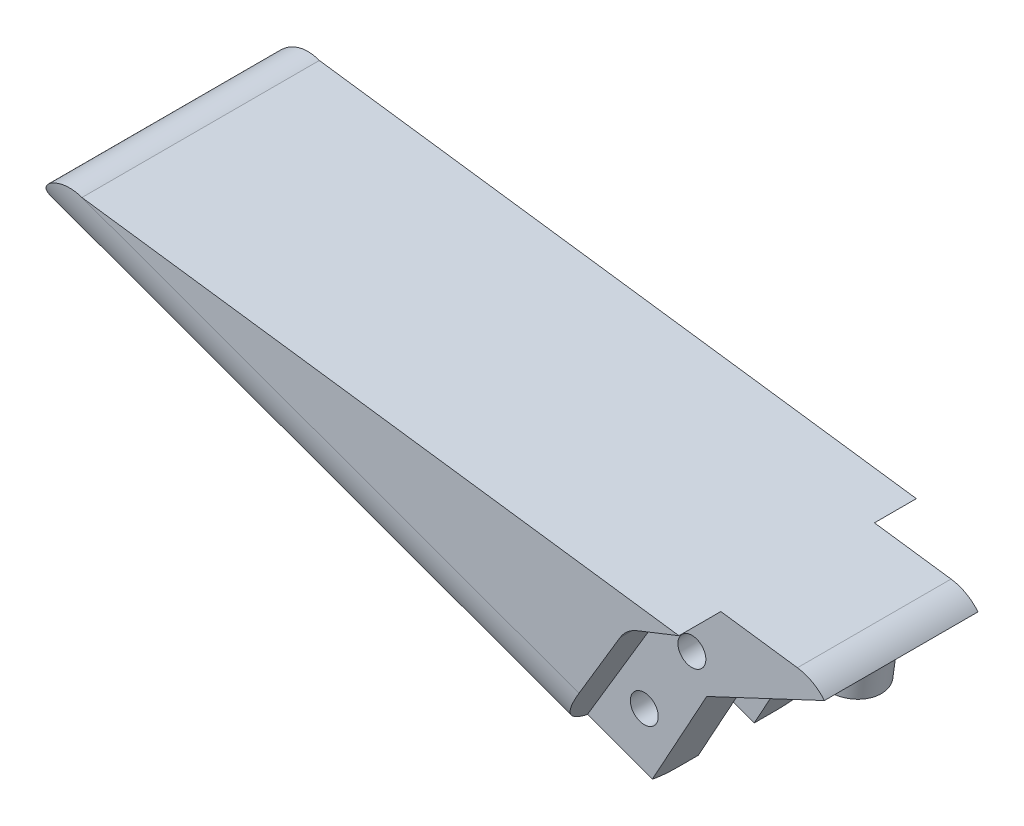
ISO-10303-21;
HEADER;
FILE_DESCRIPTION(('STEP AP214'),'2;1');
FILE_NAME('part.step','',(''),(''),'','','');
FILE_SCHEMA(('AUTOMOTIVE_DESIGN { 1 0 10303 214 1 1 1 1 }'));
ENDSEC;
DATA;
#1=APPLICATION_CONTEXT('core data for automotive mechanical design processes');
#2=APPLICATION_PROTOCOL_DEFINITION('international standard','automotive_design',2000,#1);
#3=PRODUCT_CONTEXT('',#1,'mechanical');
#4=PRODUCT('Part','Part','',(#3));
#5=PRODUCT_RELATED_PRODUCT_CATEGORY('part','',(#4));
#6=PRODUCT_DEFINITION_FORMATION('','',#4);
#7=PRODUCT_DEFINITION_CONTEXT('part definition',#1,'design');
#8=PRODUCT_DEFINITION('design','',#6,#7);
#9=PRODUCT_DEFINITION_SHAPE('','',#8);
#10=(LENGTH_UNIT() NAMED_UNIT(*) SI_UNIT(.MILLI.,.METRE.));
#11=(NAMED_UNIT(*) PLANE_ANGLE_UNIT() SI_UNIT($,.RADIAN.));
#12=(NAMED_UNIT(*) SI_UNIT($,.STERADIAN.) SOLID_ANGLE_UNIT());
#13=UNCERTAINTY_MEASURE_WITH_UNIT(LENGTH_MEASURE(1.E-05),#10,'distance_accuracy_value','');
#14=(GEOMETRIC_REPRESENTATION_CONTEXT(3) GLOBAL_UNCERTAINTY_ASSIGNED_CONTEXT((#13)) GLOBAL_UNIT_ASSIGNED_CONTEXT((#10,
#11,#12)) REPRESENTATION_CONTEXT('',''));
#15=CARTESIAN_POINT('',(0.,0.,0.));
#16=DIRECTION('',(0.,0.,1.));
#17=DIRECTION('',(1.,0.,0.));
#18=AXIS2_PLACEMENT_3D('',#15,#16,#17);
#19=CARTESIAN_POINT('',(-13.6045972487513,55.7098074103546,17.));
#20=DIRECTION('',(0.,0.,-1.));
#21=DIRECTION('',(-1.,0.,0.));
#22=AXIS2_PLACEMENT_3D('',#19,#20,#21);
#23=CYLINDRICAL_SURFACE('',#22,2.99999999999999);
#24=CARTESIAN_POINT('',(-13.6045972487513,55.7098074103546,14.));
#25=DIRECTION('',(0.,0.,1.));
#26=DIRECTION('',(1.,0.,0.));
#27=AXIS2_PLACEMENT_3D('',#24,#25,#26);
#28=CIRCLE('',#27,2.99999999999999);
#29=CARTESIAN_POINT('',(-11.2868379370372,57.6145362028503,14.));
#30=VERTEX_POINT('',#29);
#31=CARTESIAN_POINT('',(-13.21776763611,58.6847633513364,14.));
#32=VERTEX_POINT('',#31);
#33=EDGE_CURVE('E293',#30,#32,#28,.T.);
#34=ORIENTED_EDGE('',*,*,#33,.F.);
#35=DIRECTION('',(0.,0.,-1.));
#36=VECTOR('',#35,1.);
#37=CARTESIAN_POINT('',(-11.2868379370372,57.6145362028503,17.));
#38=LINE('',#37,#36);
#39=CARTESIAN_POINT('',(-11.2868379370372,57.6145362028503,3.));
#40=VERTEX_POINT('',#39);
#41=EDGE_CURVE('E215',#30,#40,#38,.T.);
#42=ORIENTED_EDGE('',*,*,#41,.T.);
#43=CARTESIAN_POINT('',(-13.6045972487513,55.7098074103546,3.));
#44=DIRECTION('',(0.,0.,-1.));
#45=DIRECTION('',(-1.,0.,0.));
#46=AXIS2_PLACEMENT_3D('',#43,#44,#45);
#47=CIRCLE('',#46,2.99999999999999);
#48=CARTESIAN_POINT('',(-13.21776763611,58.6847633513364,3.));
#49=VERTEX_POINT('',#48);
#50=EDGE_CURVE('E256',#49,#40,#47,.T.);
#51=ORIENTED_EDGE('',*,*,#50,.F.);
#52=DIRECTION('',(0.,0.,-1.));
#53=VECTOR('',#52,1.);
#54=CARTESIAN_POINT('',(-13.21776763611,58.6847633513364,17.));
#55=LINE('',#54,#53);
#56=EDGE_CURVE('E335',#32,#49,#55,.T.);
#57=ORIENTED_EDGE('',*,*,#56,.F.);
#58=EDGE_LOOP('',(#34,#42,#51,#57));
#59=FACE_BOUND('',#58,.T.);
#60=ADVANCED_FACE('F34',(#59),#23,.T.);
#61=CARTESIAN_POINT('',(-20.7770366055683,55.9187207990802,17.));
#62=DIRECTION('',(0.,0.,-1.));
#63=DIRECTION('',(-1.,0.,0.));
#64=AXIS2_PLACEMENT_3D('',#61,#62,#63);
#65=CYLINDRICAL_SURFACE('',#64,1.00000000000006);
#66=CARTESIAN_POINT('',(-20.7770366055683,55.9187207990802,14.));
#67=DIRECTION('',(0.,0.,1.));
#68=DIRECTION('',(1.,0.,0.));
#69=AXIS2_PLACEMENT_3D('',#66,#67,#68);
#70=CIRCLE('',#69,1.00000000000006);
#71=CARTESIAN_POINT('',(-19.7770366055683,55.9187207990802,14.));
#72=VERTEX_POINT('',#71);
#73=EDGE_CURVE('E287',#72,#72,#70,.T.);
#74=ORIENTED_EDGE('',*,*,#73,.T.);
#75=EDGE_LOOP('',(#74));
#76=FACE_BOUND('',#75,.T.);
#77=CARTESIAN_POINT('',(-20.7770366055683,55.9187207990802,3.));
#78=DIRECTION('',(0.,0.,-1.));
#79=DIRECTION('',(-1.,0.,0.));
#80=AXIS2_PLACEMENT_3D('',#77,#78,#79);
#81=CIRCLE('',#80,1.00000000000006);
#82=CARTESIAN_POINT('',(-21.7770366055684,55.9187207990802,3.));
#83=VERTEX_POINT('',#82);
#84=EDGE_CURVE('E262',#83,#83,#81,.T.);
#85=ORIENTED_EDGE('',*,*,#84,.T.);
#86=EDGE_LOOP('',(#85));
#87=FACE_BOUND('',#86,.T.);
#88=ADVANCED_FACE('F382',(#76,#87),#65,.F.);
#89=CARTESIAN_POINT('',(12.0644372106127,33.1538775251646,17.));
#90=DIRECTION('',(-0.341955384918189,-0.939716188391715,0.));
#91=DIRECTION('',(0.939716188391715,-0.341955384918189,0.));
#92=AXIS2_PLACEMENT_3D('',#89,#90,#91);
#93=PLANE('',#92);
#94=DIRECTION('',(0.,0.,-1.));
#95=VECTOR('',#94,1.);
#96=CARTESIAN_POINT('',(-23.8120937126513,46.2090670525373,17.));
#97=LINE('',#96,#95);
#98=CARTESIAN_POINT('',(-23.8120937126513,46.2090670525373,12.));
#99=VERTEX_POINT('',#98);
#100=CARTESIAN_POINT('',(-23.8120937126513,46.2090670525373,10.5));
#101=VERTEX_POINT('',#100);
#102=EDGE_CURVE('E229',#99,#101,#97,.T.);
#103=ORIENTED_EDGE('',*,*,#102,.F.);
#104=DIRECTION('',(-0.939716188391715,0.341955384918189,0.));
#105=VECTOR('',#104,1.);
#106=CARTESIAN_POINT('',(12.0644372106127,33.1538775251646,12.));
#107=LINE('',#106,#105);
#108=CARTESIAN_POINT('',(-63.1643616155397,60.5290501329251,12.));
#109=VERTEX_POINT('',#108);
#110=EDGE_CURVE('E358',#99,#109,#107,.T.);
#111=ORIENTED_EDGE('',*,*,#110,.T.);
#112=DIRECTION('',(0.,0.,-1.));
#113=VECTOR('',#112,1.);
#114=CARTESIAN_POINT('',(-63.1643616155397,60.5290501329251,17.));
#115=LINE('',#114,#113);
#116=CARTESIAN_POINT('',(-63.1643616155397,60.5290501329251,5.));
#117=VERTEX_POINT('',#116);
#118=EDGE_CURVE('E327',#109,#117,#115,.T.);
#119=ORIENTED_EDGE('',*,*,#118,.T.);
#120=DIRECTION('',(-0.939716188391715,0.341955384918189,0.));
#121=VECTOR('',#120,1.);
#122=CARTESIAN_POINT('',(-28.4721657385242,47.9048308831904,5.));
#123=LINE('',#122,#121);
#124=CARTESIAN_POINT('',(-23.8120937126513,46.2090670525373,5.));
#125=VERTEX_POINT('',#124);
#126=EDGE_CURVE('E190',#117,#125,#123,.F.);
#127=ORIENTED_EDGE('',*,*,#126,.T.);
#128=CARTESIAN_POINT('',(-23.8120937126513,46.2090670525373,6.5));
#129=VERTEX_POINT('',#128);
#130=EDGE_CURVE('E226',#129,#125,#97,.T.);
#131=ORIENTED_EDGE('',*,*,#130,.F.);
#132=DIRECTION('',(-0.939716188391715,0.341955384918189,0.));
#133=VECTOR('',#132,1.);
#134=CARTESIAN_POINT('',(12.0644372106127,33.1538775251646,6.5));
#135=LINE('',#134,#133);
#136=CARTESIAN_POINT('',(-26.6857847576768,47.2547807899152,6.5));
#137=VERTEX_POINT('',#136);
#138=EDGE_CURVE('E321',#129,#137,#135,.T.);
#139=ORIENTED_EDGE('',*,*,#138,.T.);
#140=DIRECTION('',(0.,0.,-1.));
#141=VECTOR('',#140,1.);
#142=CARTESIAN_POINT('',(-26.6857847576768,47.2547807899152,17.));
#143=LINE('',#142,#141);
#144=CARTESIAN_POINT('',(-26.6857847576768,47.2547807899152,10.5));
#145=VERTEX_POINT('',#144);
#146=EDGE_CURVE('E338',#145,#137,#143,.T.);
#147=ORIENTED_EDGE('',*,*,#146,.F.);
#148=DIRECTION('',(-0.939716188391715,0.341955384918189,0.));
#149=VECTOR('',#148,1.);
#150=CARTESIAN_POINT('',(12.0644372106127,33.1538775251646,10.5));
#151=LINE('',#150,#149);
#152=EDGE_CURVE('E318',#101,#145,#151,.T.);
#153=ORIENTED_EDGE('',*,*,#152,.F.);
#154=EDGE_LOOP('',(#103,#111,#119,#127,#131,#139,#147,#153));
#155=FACE_BOUND('',#154,.T.);
#156=ADVANCED_FACE('F394',(#155),#93,.T.);
#157=CARTESIAN_POINT('',(-24.1857847576768,50.6704531495727,17.));
#158=DIRECTION('',(0.,0.,-1.));
#159=DIRECTION('',(-1.,0.,0.));
#160=AXIS2_PLACEMENT_3D('',#157,#158,#159);
#161=CYLINDRICAL_SURFACE('',#160,1.00000000000012);
#162=CARTESIAN_POINT('',(-24.1857847576768,50.6704531495727,6.5));
#163=DIRECTION('',(0.,0.,1.));
#164=DIRECTION('',(1.,0.,0.));
#165=AXIS2_PLACEMENT_3D('',#162,#163,#164);
#166=CIRCLE('',#165,1.00000000000012);
#167=CARTESIAN_POINT('',(-23.1857847576767,50.6704531495727,6.5));
#168=VERTEX_POINT('',#167);
#169=EDGE_CURVE('E320',#168,#168,#166,.T.);
#170=ORIENTED_EDGE('',*,*,#169,.T.);
#171=EDGE_LOOP('',(#170));
#172=FACE_BOUND('',#171,.T.);
#173=CARTESIAN_POINT('',(-24.1857847576768,50.6704531495727,3.));
#174=DIRECTION('',(0.,0.,-1.));
#175=DIRECTION('',(-1.,0.,0.));
#176=AXIS2_PLACEMENT_3D('',#173,#174,#175);
#177=CIRCLE('',#176,1.00000000000012);
#178=CARTESIAN_POINT('',(-25.1857847576769,50.6704531495727,3.));
#179=VERTEX_POINT('',#178);
#180=EDGE_CURVE('E259',#179,#179,#177,.T.);
#181=ORIENTED_EDGE('',*,*,#180,.T.);
#182=EDGE_LOOP('',(#181));
#183=FACE_BOUND('',#182,.T.);
#184=ADVANCED_FACE('F389',(#172,#183),#161,.F.);
#185=CARTESIAN_POINT('',(7.57743523478366,55.8640908862791,17.));
#186=DIRECTION('',(0.134409712739819,0.990925844410771,0.));
#187=DIRECTION('',(-0.990925844410771,0.134409712739819,0.));
#188=AXIS2_PLACEMENT_3D('',#185,#186,#187);
#189=PLANE('',#188);
#190=DIRECTION('',(-0.990925844410771,0.134409712739819,0.));
#191=VECTOR('',#190,1.);
#192=CARTESIAN_POINT('',(7.57743523478366,55.8640908862791,3.));
#193=LINE('',#192,#191);
#194=CARTESIAN_POINT('',(-18.702448286186,59.4287083748762,3.));
#195=VERTEX_POINT('',#194);
#196=EDGE_CURVE('E351',#49,#195,#193,.T.);
#197=ORIENTED_EDGE('',*,*,#196,.T.);
#198=DIRECTION('',(0.,0.,-1.));
#199=VECTOR('',#198,1.);
#200=CARTESIAN_POINT('',(-18.702448286186,59.4287083748762,17.));
#201=LINE('',#200,#199);
#202=CARTESIAN_POINT('',(-18.702448286186,59.4287083748762,0.));
#203=VERTEX_POINT('',#202);
#204=EDGE_CURVE('E251',#195,#203,#201,.T.);
#205=ORIENTED_EDGE('',*,*,#204,.T.);
#206=DIRECTION('',(0.990925844410771,-0.134409712739819,0.));
#207=VECTOR('',#206,1.);
#208=CARTESIAN_POINT('',(7.57743523478366,55.8640908862791,0.));
#209=LINE('',#208,#207);
#210=CARTESIAN_POINT('',(-61.4545846909488,65.2276310748837,0.));
#211=VERTEX_POINT('',#210);
#212=EDGE_CURVE('E323',#211,#203,#209,.T.);
#213=ORIENTED_EDGE('',*,*,#212,.F.);
#214=DIRECTION('',(0.,0.,-1.));
#215=VECTOR('',#214,1.);
#216=CARTESIAN_POINT('',(-61.4545846909488,65.2276310748837,17.));
#217=LINE('',#216,#215);
#218=CARTESIAN_POINT('',(-61.4545846909488,65.2276310748837,17.));
#219=VERTEX_POINT('',#218);
#220=EDGE_CURVE('E332',#219,#211,#217,.T.);
#221=ORIENTED_EDGE('',*,*,#220,.F.);
#222=DIRECTION('',(0.990925844410771,-0.134409712739819,0.));
#223=VECTOR('',#222,1.);
#224=CARTESIAN_POINT('',(7.57743523478366,55.8640908862791,17.));
#225=LINE('',#224,#223);
#226=CARTESIAN_POINT('',(-18.702448286186,59.4287083748762,17.));
#227=VERTEX_POINT('',#226);
#228=EDGE_CURVE('E324',#219,#227,#225,.T.);
#229=ORIENTED_EDGE('',*,*,#228,.T.);
#230=DIRECTION('',(0.,0.,1.));
#231=VECTOR('',#230,1.);
#232=CARTESIAN_POINT('',(-18.702448286186,59.4287083748762,17.));
#233=LINE('',#232,#231);
#234=CARTESIAN_POINT('',(-18.702448286186,59.4287083748762,14.));
#235=VERTEX_POINT('',#234);
#236=EDGE_CURVE('E282',#235,#227,#233,.T.);
#237=ORIENTED_EDGE('',*,*,#236,.F.);
#238=DIRECTION('',(0.990925844410771,-0.134409712739819,0.));
#239=VECTOR('',#238,1.);
#240=CARTESIAN_POINT('',(7.57743523478366,55.8640908862791,14.));
#241=LINE('',#240,#239);
#242=EDGE_CURVE('E290',#235,#32,#241,.T.);
#243=ORIENTED_EDGE('',*,*,#242,.T.);
#244=ORIENTED_EDGE('',*,*,#56,.T.);
#245=EDGE_LOOP('',(#197,#205,#213,#221,#229,#237,#243,#244));
#246=FACE_BOUND('',#245,.T.);
#247=ADVANCED_FACE('F384',(#246),#189,.T.);
#248=CARTESIAN_POINT('',(0.,0.,0.));
#249=DIRECTION('',(0.,0.,1.));
#250=DIRECTION('',(1.,0.,0.));
#251=AXIS2_PLACEMENT_3D('',#248,#249,#250);
#252=PLANE('',#251);
#253=DIRECTION('',(-0.512546839070499,-0.858659267555437,0.));
#254=VECTOR('',#253,1.);
#255=CARTESIAN_POINT('',(-22.9236847744569,57.2000878967567,0.));
#256=LINE('',#255,#254);
#257=CARTESIAN_POINT('',(-22.9236847744569,57.2000878967567,0.));
#258=VERTEX_POINT('',#257);
#259=CARTESIAN_POINT('',(-25.862892986667,52.276092315658,0.));
#260=VERTEX_POINT('',#259);
#261=EDGE_CURVE('E238',#258,#260,#256,.T.);
#262=ORIENTED_EDGE('',*,*,#261,.T.);
#263=DIRECTION('',(-0.939716188391715,0.341955384918189,0.));
#264=VECTOR('',#263,1.);
#265=CARTESIAN_POINT('',(-61.4545846909488,65.2276310748837,0.));
#266=LINE('',#265,#264);
#267=EDGE_CURVE('E424',#260,#211,#266,.T.);
#268=ORIENTED_EDGE('',*,*,#267,.T.);
#269=ORIENTED_EDGE('',*,*,#212,.T.);
#270=DIRECTION('',(0.929799683237032,0.368065957475443,0.));
#271=VECTOR('',#270,1.);
#272=CARTESIAN_POINT('',(-22.8718132152463,57.7782439551245,0.));
#273=LINE('',#272,#271);
#274=CARTESIAN_POINT('',(-21.697201499257,58.243220007173,0.));
#275=VERTEX_POINT('',#274);
#276=EDGE_CURVE('E347',#275,#203,#273,.T.);
#277=ORIENTED_EDGE('',*,*,#276,.F.);
#278=CARTESIAN_POINT('',(-20.7770366055684,55.9187207990804,0.));
#279=DIRECTION('',(0.,0.,1.));
#280=DIRECTION('',(1.,0.,0.));
#281=AXIS2_PLACEMENT_3D('',#278,#279,#280);
#282=CIRCLE('',#281,2.5);
#283=EDGE_CURVE('E243',#275,#258,#282,.T.);
#284=ORIENTED_EDGE('',*,*,#283,.T.);
#285=EDGE_LOOP('',(#262,#268,#269,#277,#284));
#286=FACE_BOUND('',#285,.T.);
#287=ADVANCED_FACE('F388',(#286),#252,.F.);
#288=CARTESIAN_POINT('',(-24.1857847576768,50.6704531495727,10.5));
#289=DIRECTION('',(0.,0.,1.));
#290=DIRECTION('',(1.,0.,0.));
#291=AXIS2_PLACEMENT_3D('',#288,#289,#290);
#292=CIRCLE('',#291,1.00000000000012);
#293=CARTESIAN_POINT('',(-23.1857847576767,50.6704531495727,10.5));
#294=VERTEX_POINT('',#293);
#295=EDGE_CURVE('E315',#294,#294,#292,.T.);
#296=ORIENTED_EDGE('',*,*,#295,.F.);
#297=EDGE_LOOP('',(#296));
#298=FACE_BOUND('',#297,.T.);
#299=CARTESIAN_POINT('',(-24.1857847576768,50.6704531495727,14.));
#300=DIRECTION('',(0.,0.,1.));
#301=DIRECTION('',(1.,0.,0.));
#302=AXIS2_PLACEMENT_3D('',#299,#300,#301);
#303=CIRCLE('',#302,1.00000000000012);
#304=CARTESIAN_POINT('',(-23.1857847576767,50.6704531495727,14.));
#305=VERTEX_POINT('',#304);
#306=EDGE_CURVE('E286',#305,#305,#303,.T.);
#307=ORIENTED_EDGE('',*,*,#306,.T.);
#308=EDGE_LOOP('',(#307));
#309=FACE_BOUND('',#308,.T.);
#310=ADVANCED_FACE('F380',(#298,#309),#161,.F.);
#311=CARTESIAN_POINT('',(-62.3094731532442,62.8783406039045,17.));
#312=DIRECTION('',(0.,0.,-1.));
#313=DIRECTION('',(-1.,0.,0.));
#314=AXIS2_PLACEMENT_3D('',#311,#312,#313);
#315=CYLINDRICAL_SURFACE('',#314,2.49999999999995);
#316=ORIENTED_EDGE('',*,*,#118,.F.);
#317=CARTESIAN_POINT('',(-61.4545846909488,65.2276310748837,17.));
#318=CARTESIAN_POINT('',(-61.5204900513567,65.2516205941729,16.9999890662718));
#319=CARTESIAN_POINT('',(-61.5874061855276,65.2728230518161,16.9999997162415));
#320=CARTESIAN_POINT('',(-61.7227799949917,65.3095339566756,16.999984625409));
#321=CARTESIAN_POINT('',(-61.7912376128699,65.3250426155947,16.9999588859599));
#322=CARTESIAN_POINT('',(-61.929210997852,65.3502463109526,16.9997914792829));
#323=CARTESIAN_POINT('',(-61.9987266357616,65.3599420514555,16.9996498260994));
#324=CARTESIAN_POINT('',(-62.1383055860734,65.3734608498818,16.9990939676281));
#325=CARTESIAN_POINT('',(-62.2083688917394,65.3772839799237,16.9986797656873));
#326=CARTESIAN_POINT('',(-62.4187359079743,65.3798779042605,16.9967344565259));
#327=CARTESIAN_POINT('',(-62.5592532787745,65.3697798784817,16.9945007970887));
#328=CARTESIAN_POINT('',(-62.8363871803952,65.3262075741263,16.9860083697833));
#329=CARTESIAN_POINT('',(-62.9730050509749,65.2927414273055,16.9797510021651));
#330=CARTESIAN_POINT('',(-63.2369636609294,65.2040505589438,16.9606994667724));
#331=CARTESIAN_POINT('',(-63.3643861357467,65.1490558505006,16.9479739894606));
#332=CARTESIAN_POINT('',(-63.6074617167419,65.0194112002341,16.9134920650633));
#333=CARTESIAN_POINT('',(-63.7231184033324,64.9447672627659,16.8917383756243));
#334=CARTESIAN_POINT('',(-63.9346777744545,64.7824833670737,16.8382885878081));
#335=CARTESIAN_POINT('',(-64.0311924778212,64.6954952842462,16.8070327444168));
#336=CARTESIAN_POINT('',(-64.207691900822,64.5102507770814,16.7333916598093));
#337=CARTESIAN_POINT('',(-64.2876793879122,64.4119962435847,16.6910082845839));
#338=CARTESIAN_POINT('',(-64.4291752329435,64.2094971314752,16.5956434467487));
#339=CARTESIAN_POINT('',(-64.4908692479543,64.1053264942414,16.5427782410881));
#340=CARTESIAN_POINT('',(-64.5969959481208,63.8938452876423,16.4269453992834));
#341=CARTESIAN_POINT('',(-64.6414203389521,63.7865332360458,16.3639729292449));
#342=CARTESIAN_POINT('',(-64.702109195449,63.607116907193,16.2512889281742));
#343=CARTESIAN_POINT('',(-64.7228320524227,63.5349604398557,16.2039634576914));
#344=CARTESIAN_POINT('',(-64.7573721534314,63.3914094596698,16.1057461635402));
#345=CARTESIAN_POINT('',(-64.7711874893727,63.320015162683,16.0548533588737));
#346=CARTESIAN_POINT('',(-64.8030341863334,63.1077644727296,15.8973459307161));
#347=CARTESIAN_POINT('',(-64.8114333114238,62.9689434461102,15.7859671135806));
#348=CARTESIAN_POINT('',(-64.805873098533,62.6501091291649,15.5104945539608));
#349=CARTESIAN_POINT('',(-64.7824354383011,62.4739800380995,15.3422025033717));
#350=CARTESIAN_POINT('',(-64.7045771385855,62.1416792787595,14.9934432042787));
#351=CARTESIAN_POINT('',(-64.6500957425656,61.9855474838196,14.812952694191));
#352=CARTESIAN_POINT('',(-64.5367513208631,61.7372957116864,14.4981771561333));
#353=CARTESIAN_POINT('',(-64.4838507684458,61.6398251525866,14.3658512837086));
#354=CARTESIAN_POINT('',(-64.3679961219815,61.4555494869244,14.0981472157038));
#355=CARTESIAN_POINT('',(-64.3050385944524,61.3687480408027,13.9627679913049));
#356=CARTESIAN_POINT('',(-64.1706649332872,61.2058860683545,13.6898202140528));
#357=CARTESIAN_POINT('',(-64.0992502112959,61.1298237541238,13.5522520298821));
#358=CARTESIAN_POINT('',(-63.9492645094208,60.9884428959294,13.2755869993246));
#359=CARTESIAN_POINT('',(-63.8706925757218,60.9231257872039,13.1364899513701));
#360=CARTESIAN_POINT('',(-63.5981932195892,60.7230605306923,12.6703752015192));
#361=CARTESIAN_POINT('',(-63.3903759644224,60.6121171716422,12.3405350222981));
#362=CARTESIAN_POINT('',(-63.1694751784973,60.5309156538491,12.0076978863553));
#363=CARTESIAN_POINT('',(-63.1669191124677,60.529980792246,12.0038488814026));
#364=CARTESIAN_POINT('',(-63.1643616155397,60.5290501329252,12.));
#365=B_SPLINE_CURVE_WITH_KNOTS('',3,(#317,#318,#319,#320,#321,#322,#323,#324,#325,#326,#327,
#328,#329,#330,#331,#332,#333,#334,#335,#336,#337,#338,#339,#340,#341,#342,#343,#344,#345,#346,
#347,#348,#349,#350,#351,#352,#353,#354,#355,#356,#357,#358,#359,#360,#361,#362,#363,#364),
.UNSPECIFIED.,.F.,.F.,(4,2,2,2,2,2,2,2,2,2,2,2,2,2,2,2,2,2,2,2,2,2,2,4),(0.,0.210338874410144,
0.420669927355957,0.630975499730648,0.841278489424372,1.26177439096401,1.68212403911139,
2.09810009989928,2.5139491951726,2.91288870638393,3.3117613615727,3.70643529072688,
4.10129854195386,4.36719997237784,4.63317481335418,5.16549819240343,5.8958211096196,
6.62757829524908,7.14490075042501,7.66240020003356,8.17981339190683,8.69729563869389,
9.90603770111635,9.92017984302562),.UNSPECIFIED.);
#366=EDGE_CURVE('E368',#109,#219,#365,.F.);
#367=ORIENTED_EDGE('',*,*,#366,.T.);
#368=ORIENTED_EDGE('',*,*,#220,.T.);
#369=CARTESIAN_POINT('',(-61.4545846909488,65.2276310748837,0.));
#370=CARTESIAN_POINT('',(-61.5204900513567,65.2516205941729,1.09337282147125E-05));
#371=CARTESIAN_POINT('',(-61.5874061855276,65.2728230518161,2.83758506594792E-07));
#372=CARTESIAN_POINT('',(-61.7227799949917,65.3095339566756,1.53745910401885E-05));
#373=CARTESIAN_POINT('',(-61.7912376128699,65.3250426155947,4.11140401034743E-05));
#374=CARTESIAN_POINT('',(-61.929210997852,65.3502463109526,0.00020852071709331));
#375=CARTESIAN_POINT('',(-61.9987266357616,65.3599420514555,0.000350173900562684));
#376=CARTESIAN_POINT('',(-62.1383055860735,65.3734608498818,0.000906032371941109));
#377=CARTESIAN_POINT('',(-62.2083688917394,65.3772839799237,0.0013202343127223));
#378=CARTESIAN_POINT('',(-62.4187359079743,65.3798779042605,0.00326554347406703));
#379=CARTESIAN_POINT('',(-62.5592532787745,65.3697798784817,0.00549920291129953));
#380=CARTESIAN_POINT('',(-62.8363871803952,65.3262075741263,0.0139916302167071));
#381=CARTESIAN_POINT('',(-62.9730050509749,65.2927414273055,0.0202489978348839));
#382=CARTESIAN_POINT('',(-63.2369636609294,65.2040505589438,0.0393005332276252));
#383=CARTESIAN_POINT('',(-63.3643861357467,65.1490558505006,0.0520260105394239));
#384=CARTESIAN_POINT('',(-63.6074617167419,65.0194112002341,0.0865079349366549));
#385=CARTESIAN_POINT('',(-63.7231184033324,64.9447672627659,0.108261624375722));
#386=CARTESIAN_POINT('',(-63.9346777744545,64.7824833670737,0.161711412191918));
#387=CARTESIAN_POINT('',(-64.0311924778212,64.6954952842462,0.192967255583228));
#388=CARTESIAN_POINT('',(-64.207691900822,64.5102507770814,0.266608340190714));
#389=CARTESIAN_POINT('',(-64.2876793879122,64.4119962435847,0.308991715416076));
#390=CARTESIAN_POINT('',(-64.4291752329435,64.2094971314752,0.404356553251308));
#391=CARTESIAN_POINT('',(-64.4908692479543,64.1053264942414,0.457221758911887));
#392=CARTESIAN_POINT('',(-64.5969959481208,63.8938452876423,0.573054600716654));
#393=CARTESIAN_POINT('',(-64.6414203389521,63.7865332360458,0.636027070755138));
#394=CARTESIAN_POINT('',(-64.702109195449,63.607116907193,0.748711071825805));
#395=CARTESIAN_POINT('',(-64.7228320524227,63.5349604398557,0.796036542308616));
#396=CARTESIAN_POINT('',(-64.7573721534314,63.3914094596699,0.894253836459793));
#397=CARTESIAN_POINT('',(-64.7711874893727,63.320015162683,0.945146641126254));
#398=CARTESIAN_POINT('',(-64.8030341863334,63.1077644727297,1.10265406928394));
#399=CARTESIAN_POINT('',(-64.8114333114238,62.9689434461102,1.21403288641936));
#400=CARTESIAN_POINT('',(-64.805873098533,62.6501091291649,1.48950544603928));
#401=CARTESIAN_POINT('',(-64.7824354383011,62.4739800380994,1.6577974966284));
#402=CARTESIAN_POINT('',(-64.7045771385855,62.1416792787595,2.00655679572136));
#403=CARTESIAN_POINT('',(-64.6500957425656,61.9855474838196,2.18704730580901));
#404=CARTESIAN_POINT('',(-64.5367513208631,61.7372957116864,2.50182284386675));
#405=CARTESIAN_POINT('',(-64.4838507684458,61.6398251525866,2.63414871629139));
#406=CARTESIAN_POINT('',(-64.3679961219815,61.4555494869245,2.90185278429611));
#407=CARTESIAN_POINT('',(-64.3050385944523,61.3687480408028,3.03723200869499));
#408=CARTESIAN_POINT('',(-64.1706649332873,61.2058860683546,3.31017978594715));
#409=CARTESIAN_POINT('',(-64.0992502112962,61.1298237541239,3.44774797011802));
#410=CARTESIAN_POINT('',(-63.9492645094206,60.9884428959293,3.72441300067516));
#411=CARTESIAN_POINT('',(-63.8706925757207,60.9231257872035,3.86351004862913));
#412=CARTESIAN_POINT('',(-63.5981932195918,60.7230605306931,4.32962479848278));
#413=CARTESIAN_POINT('',(-63.3903759644379,60.6121171716475,4.65946497771358));
#414=CARTESIAN_POINT('',(-63.1694751784977,60.5309156538492,4.992302113645));
#415=CARTESIAN_POINT('',(-63.1669191124679,60.5299807922461,4.99615111859758));
#416=CARTESIAN_POINT('',(-63.1643616155397,60.5290501329252,5.));
#417=B_SPLINE_CURVE_WITH_KNOTS('',3,(#369,#370,#371,#372,#373,#374,#375,#376,#377,#378,#379,
#380,#381,#382,#383,#384,#385,#386,#387,#388,#389,#390,#391,#392,#393,#394,#395,#396,#397,#398,
#399,#400,#401,#402,#403,#404,#405,#406,#407,#408,#409,#410,#411,#412,#413,#414,#415,#416),
.UNSPECIFIED.,.F.,.F.,(4,2,2,2,2,2,2,2,2,2,2,2,2,2,2,2,2,2,2,2,2,2,2,4),(0.,0.21033887441014,
0.42066992735596,0.630975499730678,0.841278489424374,1.26177439096401,1.68212403911139,
2.09810009989927,2.51394919517261,2.91288870638394,3.31176136157271,3.70643529072688,
4.10129854195387,4.36719997237781,4.63317481335415,5.16549819240344,5.8958211096197,
6.6275782952491,7.14490075042498,7.66240020003342,8.17981339190675,8.69729563869392,
9.90603770111638,9.92017984302563),.UNSPECIFIED.);
#418=EDGE_CURVE('E361',#211,#117,#417,.T.);
#419=ORIENTED_EDGE('',*,*,#418,.T.);
#420=EDGE_LOOP('',(#316,#367,#368,#419));
#421=FACE_BOUND('',#420,.T.);
#422=ADVANCED_FACE('F374',(#421),#315,.T.);
#423=CARTESIAN_POINT('',(0.,0.,17.));
#424=DIRECTION('',(0.,0.,1.));
#425=DIRECTION('',(1.,0.,0.));
#426=AXIS2_PLACEMENT_3D('',#423,#424,#425);
#427=PLANE('',#426);
#428=ORIENTED_EDGE('',*,*,#228,.F.);
#429=DIRECTION('',(-0.939716188391715,0.341955384918189,0.));
#430=VECTOR('',#429,1.);
#431=CARTESIAN_POINT('',(13.7742141352037,37.8524584671232,17.));
#432=LINE('',#431,#430);
#433=CARTESIAN_POINT('',(-25.8628929866671,52.276092315658,17.));
#434=VERTEX_POINT('',#433);
#435=EDGE_CURVE('E414',#219,#434,#432,.F.);
#436=ORIENTED_EDGE('',*,*,#435,.T.);
#437=DIRECTION('',(-0.512546839070499,-0.858659267555437,0.));
#438=VECTOR('',#437,1.);
#439=CARTESIAN_POINT('',(-22.9236847744569,57.2000878967567,17.));
#440=LINE('',#439,#438);
#441=CARTESIAN_POINT('',(-22.9236847744569,57.2000878967567,17.));
#442=VERTEX_POINT('',#441);
#443=EDGE_CURVE('E270',#442,#434,#440,.T.);
#444=ORIENTED_EDGE('',*,*,#443,.F.);
#445=CARTESIAN_POINT('',(-20.7770366055684,55.9187207990804,17.));
#446=DIRECTION('',(0.,0.,1.));
#447=DIRECTION('',(1.,0.,0.));
#448=AXIS2_PLACEMENT_3D('',#445,#446,#447);
#449=CIRCLE('',#448,2.5);
#450=CARTESIAN_POINT('',(-21.697201499257,58.243220007173,17.));
#451=VERTEX_POINT('',#450);
#452=EDGE_CURVE('E265',#451,#442,#449,.T.);
#453=ORIENTED_EDGE('',*,*,#452,.F.);
#454=DIRECTION('',(-0.929799683237032,-0.368065957475443,0.));
#455=VECTOR('',#454,1.);
#456=CARTESIAN_POINT('',(-22.8718132152463,57.7782439551245,17.));
#457=LINE('',#456,#455);
#458=EDGE_CURVE('E345',#227,#451,#457,.T.);
#459=ORIENTED_EDGE('',*,*,#458,.F.);
#460=EDGE_LOOP('',(#428,#436,#444,#453,#459));
#461=FACE_BOUND('',#460,.T.);
#462=ADVANCED_FACE('F379',(#461),#427,.T.);
#463=CARTESIAN_POINT('',(-24.5117116598858,53.1491164293299,6.5));
#464=DIRECTION('',(-0.130370760883589,0.991465311902859,0.));
#465=DIRECTION('',(-0.991465311902859,-0.130370760883589,0.));
#466=AXIS2_PLACEMENT_3D('',#463,#464,#465);
#467=PLANE('',#466);
#468=DIRECTION('',(-0.991465311902866,-0.130370760883539,0.));
#469=VECTOR('',#468,1.);
#470=CARTESIAN_POINT('',(-10.6984035680746,54.9654699261482,6.5));
#471=LINE('',#470,#469);
#472=CARTESIAN_POINT('',(-19.3474223651698,53.8281843873232,6.5));
#473=VERTEX_POINT('',#472);
#474=CARTESIAN_POINT('',(-24.5117116598858,53.1491164293299,6.5));
#475=VERTEX_POINT('',#474);
#476=EDGE_CURVE('E303',#473,#475,#471,.T.);
#477=ORIENTED_EDGE('',*,*,#476,.F.);
#478=DIRECTION('',(0.,0.,1.));
#479=VECTOR('',#478,1.);
#480=CARTESIAN_POINT('',(-19.3474223651698,53.8281843873232,6.5));
#481=LINE('',#480,#479);
#482=CARTESIAN_POINT('',(-19.3474223651699,53.8281843873232,10.5));
#483=VERTEX_POINT('',#482);
#484=EDGE_CURVE('E221',#473,#483,#481,.T.);
#485=ORIENTED_EDGE('',*,*,#484,.T.);
#486=DIRECTION('',(-0.991465311902859,-0.130370760883589,0.));
#487=VECTOR('',#486,1.);
#488=CARTESIAN_POINT('',(-24.5117116598858,53.1491164293299,10.5));
#489=LINE('',#488,#487);
#490=CARTESIAN_POINT('',(-24.5117116598858,53.1491164293299,10.5));
#491=VERTEX_POINT('',#490);
#492=EDGE_CURVE('E300',#483,#491,#489,.T.);
#493=ORIENTED_EDGE('',*,*,#492,.T.);
#494=DIRECTION('',(0.,0.,1.));
#495=VECTOR('',#494,1.);
#496=CARTESIAN_POINT('',(-24.5117116598858,53.1491164293299,6.5));
#497=LINE('',#496,#495);
#498=EDGE_CURVE('E312',#475,#491,#497,.T.);
#499=ORIENTED_EDGE('',*,*,#498,.F.);
#500=EDGE_LOOP('',(#477,#485,#493,#499));
#501=FACE_BOUND('',#500,.T.);
#502=ADVANCED_FACE('F496',(#501),#467,.F.);
#503=CARTESIAN_POINT('',(-24.1857847576768,50.6704531495729,6.5));
#504=DIRECTION('',(0.,0.,1.));
#505=DIRECTION('',(1.,0.,0.));
#506=AXIS2_PLACEMENT_3D('',#503,#504,#505);
#507=CYLINDRICAL_SURFACE('',#506,2.49999999999988);
#508=CARTESIAN_POINT('',(-24.1857847576768,50.6704531495729,10.5));
#509=DIRECTION('',(0.,0.,1.));
#510=DIRECTION('',(1.,0.,0.));
#511=AXIS2_PLACEMENT_3D('',#508,#509,#510);
#512=CIRCLE('',#511,2.49999999999988);
#513=CARTESIAN_POINT('',(-26.6857847576768,50.6704531495729,10.5));
#514=VERTEX_POINT('',#513);
#515=EDGE_CURVE('E295',#491,#514,#512,.T.);
#516=ORIENTED_EDGE('',*,*,#515,.T.);
#517=DIRECTION('',(0.,0.,1.));
#518=VECTOR('',#517,1.);
#519=CARTESIAN_POINT('',(-26.6857847576768,50.6704531495729,6.5));
#520=LINE('',#519,#518);
#521=CARTESIAN_POINT('',(-26.6857847576768,50.6704531495729,6.5));
#522=VERTEX_POINT('',#521);
#523=EDGE_CURVE('E305',#522,#514,#520,.T.);
#524=ORIENTED_EDGE('',*,*,#523,.F.);
#525=CARTESIAN_POINT('',(-24.1857847576768,50.6704531495729,6.5));
#526=DIRECTION('',(0.,0.,1.));
#527=DIRECTION('',(1.,0.,0.));
#528=AXIS2_PLACEMENT_3D('',#525,#526,#527);
#529=CIRCLE('',#528,2.49999999999988);
#530=EDGE_CURVE('E296',#475,#522,#529,.T.);
#531=ORIENTED_EDGE('',*,*,#530,.F.);
#532=ORIENTED_EDGE('',*,*,#498,.T.);
#533=EDGE_LOOP('',(#516,#524,#531,#532));
#534=FACE_BOUND('',#533,.T.);
#535=ADVANCED_FACE('F500',(#534),#507,.F.);
#536=CARTESIAN_POINT('',(-26.6857847576768,47.0099611022409,6.5));
#537=DIRECTION('',(-1.,0.,0.));
#538=DIRECTION('',(0.,0.,1.));
#539=AXIS2_PLACEMENT_3D('',#536,#537,#538);
#540=PLANE('',#539);
#541=ORIENTED_EDGE('',*,*,#146,.T.);
#542=DIRECTION('',(0.,-1.,0.));
#543=VECTOR('',#542,1.);
#544=CARTESIAN_POINT('',(-26.6857847576768,50.6704531495729,6.5));
#545=LINE('',#544,#543);
#546=EDGE_CURVE('E299',#522,#137,#545,.T.);
#547=ORIENTED_EDGE('',*,*,#546,.F.);
#548=ORIENTED_EDGE('',*,*,#523,.T.);
#549=DIRECTION('',(0.,-1.,0.));
#550=VECTOR('',#549,1.);
#551=CARTESIAN_POINT('',(-26.6857847576768,47.0099611022409,10.5));
#552=LINE('',#551,#550);
#553=EDGE_CURVE('E308',#514,#145,#552,.T.);
#554=ORIENTED_EDGE('',*,*,#553,.T.);
#555=EDGE_LOOP('',(#541,#547,#548,#554));
#556=FACE_BOUND('',#555,.T.);
#557=ADVANCED_FACE('F465',(#556),#540,.F.);
#558=CARTESIAN_POINT('',(-24.1857847576768,50.6704531495729,6.5));
#559=DIRECTION('',(0.,0.,1.));
#560=DIRECTION('',(1.,0.,0.));
#561=AXIS2_PLACEMENT_3D('',#558,#559,#560);
#562=PLANE('',#561);
#563=DIRECTION('',(-0.482117089862092,-0.876106792384871,0.));
#564=VECTOR('',#563,1.);
#565=CARTESIAN_POINT('',(-22.0145260133923,49.4756205604059,6.5));
#566=LINE('',#565,#564);
#567=CARTESIAN_POINT('',(-19.7141218932016,53.655932184509,6.5));
#568=VERTEX_POINT('',#567);
#569=EDGE_CURVE('E228',#568,#129,#566,.T.);
#570=ORIENTED_EDGE('',*,*,#569,.F.);
#571=DIRECTION('',(-0.905115445828585,-0.425165884946713,0.));
#572=VECTOR('',#571,1.);
#573=CARTESIAN_POINT('',(-24.5263446250199,51.3954548655508,6.5));
#574=LINE('',#573,#572);
#575=EDGE_CURVE('E224',#473,#568,#574,.T.);
#576=ORIENTED_EDGE('',*,*,#575,.F.);
#577=ORIENTED_EDGE('',*,*,#476,.T.);
#578=ORIENTED_EDGE('',*,*,#530,.T.);
#579=ORIENTED_EDGE('',*,*,#546,.T.);
#580=ORIENTED_EDGE('',*,*,#138,.F.);
#581=EDGE_LOOP('',(#570,#576,#577,#578,#579,#580));
#582=FACE_BOUND('',#581,.T.);
#583=ORIENTED_EDGE('',*,*,#169,.F.);
#584=EDGE_LOOP('',(#583));
#585=FACE_BOUND('',#584,.T.);
#586=ADVANCED_FACE('F458',(#582,#585),#562,.T.);
#587=CARTESIAN_POINT('',(-24.1857847576768,50.6704531495729,10.5));
#588=DIRECTION('',(0.,0.,1.));
#589=DIRECTION('',(1.,0.,0.));
#590=AXIS2_PLACEMENT_3D('',#587,#588,#589);
#591=PLANE('',#590);
#592=DIRECTION('',(-0.905115445828585,-0.425165884946713,0.));
#593=VECTOR('',#592,1.);
#594=CARTESIAN_POINT('',(-24.5263446250199,51.3954548655508,10.5));
#595=LINE('',#594,#593);
#596=CARTESIAN_POINT('',(-19.7141218932016,53.655932184509,10.5));
#597=VERTEX_POINT('',#596);
#598=EDGE_CURVE('E218',#483,#597,#595,.T.);
#599=ORIENTED_EDGE('',*,*,#598,.T.);
#600=DIRECTION('',(-0.482117089862092,-0.876106792384871,0.));
#601=VECTOR('',#600,1.);
#602=CARTESIAN_POINT('',(-22.0145260133923,49.4756205604059,10.5));
#603=LINE('',#602,#601);
#604=EDGE_CURVE('E231',#597,#101,#603,.T.);
#605=ORIENTED_EDGE('',*,*,#604,.T.);
#606=ORIENTED_EDGE('',*,*,#152,.T.);
#607=ORIENTED_EDGE('',*,*,#553,.F.);
#608=ORIENTED_EDGE('',*,*,#515,.F.);
#609=ORIENTED_EDGE('',*,*,#492,.F.);
#610=EDGE_LOOP('',(#599,#605,#606,#607,#608,#609));
#611=FACE_BOUND('',#610,.T.);
#612=ORIENTED_EDGE('',*,*,#295,.T.);
#613=EDGE_LOOP('',(#612));
#614=FACE_BOUND('',#613,.T.);
#615=ADVANCED_FACE('F468',(#611,#614),#591,.F.);
#616=CARTESIAN_POINT('',(-20.7770366055684,55.9187207990804,14.));
#617=DIRECTION('',(0.,0.,1.));
#618=DIRECTION('',(1.,0.,0.));
#619=AXIS2_PLACEMENT_3D('',#616,#617,#618);
#620=CYLINDRICAL_SURFACE('',#619,2.5);
#621=ORIENTED_EDGE('',*,*,#452,.T.);
#622=DIRECTION('',(0.,0.,1.));
#623=VECTOR('',#622,1.);
#624=CARTESIAN_POINT('',(-22.9236847744569,57.2000878967567,14.));
#625=LINE('',#624,#623);
#626=CARTESIAN_POINT('',(-22.9236847744569,57.2000878967567,14.));
#627=VERTEX_POINT('',#626);
#628=EDGE_CURVE('E275',#627,#442,#625,.T.);
#629=ORIENTED_EDGE('',*,*,#628,.F.);
#630=CARTESIAN_POINT('',(-20.7770366055684,55.9187207990804,14.));
#631=DIRECTION('',(0.,0.,1.));
#632=DIRECTION('',(1.,0.,0.));
#633=AXIS2_PLACEMENT_3D('',#630,#631,#632);
#634=CIRCLE('',#633,2.5);
#635=CARTESIAN_POINT('',(-21.697201499257,58.243220007173,14.));
#636=VERTEX_POINT('',#635);
#637=EDGE_CURVE('E266',#636,#627,#634,.T.);
#638=ORIENTED_EDGE('',*,*,#637,.F.);
#639=DIRECTION('',(0.,0.,1.));
#640=VECTOR('',#639,1.);
#641=CARTESIAN_POINT('',(-21.697201499257,58.243220007173,14.));
#642=LINE('',#641,#640);
#643=EDGE_CURVE('E279',#636,#451,#642,.T.);
#644=ORIENTED_EDGE('',*,*,#643,.T.);
#645=EDGE_LOOP('',(#621,#629,#638,#644));
#646=FACE_BOUND('',#645,.T.);
#647=ADVANCED_FACE('F544',(#646),#620,.F.);
#648=CARTESIAN_POINT('',(-21.697201499257,58.243220007173,14.));
#649=DIRECTION('',(-0.368065957475443,0.929799683237032,0.));
#650=DIRECTION('',(-0.929799683237032,-0.368065957475443,0.));
#651=AXIS2_PLACEMENT_3D('',#648,#649,#650);
#652=PLANE('',#651);
#653=ORIENTED_EDGE('',*,*,#236,.T.);
#654=ORIENTED_EDGE('',*,*,#458,.T.);
#655=ORIENTED_EDGE('',*,*,#643,.F.);
#656=DIRECTION('',(-0.929799683237032,-0.368065957475443,0.));
#657=VECTOR('',#656,1.);
#658=CARTESIAN_POINT('',(-21.697201499257,58.243220007173,14.));
#659=LINE('',#658,#657);
#660=EDGE_CURVE('E273',#235,#636,#659,.T.);
#661=ORIENTED_EDGE('',*,*,#660,.F.);
#662=EDGE_LOOP('',(#653,#654,#655,#661));
#663=FACE_BOUND('',#662,.T.);
#664=ADVANCED_FACE('F492',(#663),#652,.F.);
#665=CARTESIAN_POINT('',(-22.9236847744569,57.2000878967567,14.));
#666=DIRECTION('',(-0.858659267555437,0.512546839070499,0.));
#667=DIRECTION('',(-0.512546839070499,-0.858659267555437,0.));
#668=AXIS2_PLACEMENT_3D('',#665,#666,#667);
#669=PLANE('',#668);
#670=ORIENTED_EDGE('',*,*,#443,.T.);
#671=CARTESIAN_POINT('',(-25.8628929866671,52.276092315658,12.));
#672=DIRECTION('',(-0.858659267555437,0.512546839070499,0.));
#673=DIRECTION('',(-0.512546839070499,-0.858659267555437,0.));
#674=AXIS2_PLACEMENT_3D('',#671,#672,#673);
#675=ELLIPSE('',#674,5.09079864113311,5.);
#676=CARTESIAN_POINT('',(-28.2543309655013,48.2697650363132,14.));
#677=VERTEX_POINT('',#676);
#678=EDGE_CURVE('E413',#434,#677,#675,.F.);
#679=ORIENTED_EDGE('',*,*,#678,.T.);
#680=DIRECTION('',(-0.512546839070499,-0.858659267555437,0.));
#681=VECTOR('',#680,1.);
#682=CARTESIAN_POINT('',(-22.9236847744569,57.2000878967567,14.));
#683=LINE('',#682,#681);
#684=EDGE_CURVE('E269',#627,#677,#683,.T.);
#685=ORIENTED_EDGE('',*,*,#684,.F.);
#686=ORIENTED_EDGE('',*,*,#628,.T.);
#687=EDGE_LOOP('',(#670,#679,#685,#686));
#688=FACE_BOUND('',#687,.T.);
#689=ADVANCED_FACE('F482',(#688),#669,.F.);
#690=CARTESIAN_POINT('',(-20.7770366055684,55.9187207990804,14.));
#691=DIRECTION('',(0.,0.,1.));
#692=DIRECTION('',(1.,0.,0.));
#693=AXIS2_PLACEMENT_3D('',#690,#691,#692);
#694=PLANE('',#693);
#695=ORIENTED_EDGE('',*,*,#684,.T.);
#696=DIRECTION('',(-0.939716188391715,0.341955384918189,0.));
#697=VECTOR('',#696,1.);
#698=CARTESIAN_POINT('',(-28.2543309655013,48.2697650363132,14.));
#699=LINE('',#698,#697);
#700=CARTESIAN_POINT('',(-23.6084338215062,46.5791593345171,14.));
#701=VERTEX_POINT('',#700);
#702=EDGE_CURVE('E416',#677,#701,#699,.F.);
#703=ORIENTED_EDGE('',*,*,#702,.T.);
#704=DIRECTION('',(-0.482117089862092,-0.876106792384871,0.));
#705=VECTOR('',#704,1.);
#706=CARTESIAN_POINT('',(-22.172973594539,49.1876884273233,14.));
#707=LINE('',#706,#705);
#708=CARTESIAN_POINT('',(-19.7141218932016,53.655932184509,14.));
#709=VERTEX_POINT('',#708);
#710=EDGE_CURVE('E209',#709,#701,#707,.T.);
#711=ORIENTED_EDGE('',*,*,#710,.F.);
#712=DIRECTION('',(-0.905115445828585,-0.425165884946713,0.));
#713=VECTOR('',#712,1.);
#714=CARTESIAN_POINT('',(-19.7141218932016,53.655932184509,14.));
#715=LINE('',#714,#713);
#716=EDGE_CURVE('E202',#30,#709,#715,.T.);
#717=ORIENTED_EDGE('',*,*,#716,.F.);
#718=ORIENTED_EDGE('',*,*,#33,.T.);
#719=ORIENTED_EDGE('',*,*,#242,.F.);
#720=ORIENTED_EDGE('',*,*,#660,.T.);
#721=ORIENTED_EDGE('',*,*,#637,.T.);
#722=EDGE_LOOP('',(#695,#703,#711,#717,#718,#719,#720,#721));
#723=FACE_BOUND('',#722,.T.);
#724=ORIENTED_EDGE('',*,*,#73,.F.);
#725=EDGE_LOOP('',(#724));
#726=FACE_BOUND('',#725,.T.);
#727=ORIENTED_EDGE('',*,*,#306,.F.);
#728=EDGE_LOOP('',(#727));
#729=FACE_BOUND('',#728,.T.);
#730=ADVANCED_FACE('F478',(#723,#726,#729),#694,.T.);
#731=CARTESIAN_POINT('',(-20.7770366055684,55.9187207990804,3.));
#732=DIRECTION('',(0.,0.,-1.));
#733=DIRECTION('',(-1.,0.,0.));
#734=AXIS2_PLACEMENT_3D('',#731,#732,#733);
#735=CYLINDRICAL_SURFACE('',#734,2.5);
#736=ORIENTED_EDGE('',*,*,#283,.F.);
#737=DIRECTION('',(0.,0.,-1.));
#738=VECTOR('',#737,1.);
#739=CARTESIAN_POINT('',(-21.697201499257,58.243220007173,3.));
#740=LINE('',#739,#738);
#741=CARTESIAN_POINT('',(-21.697201499257,58.243220007173,3.));
#742=VERTEX_POINT('',#741);
#743=EDGE_CURVE('E242',#742,#275,#740,.T.);
#744=ORIENTED_EDGE('',*,*,#743,.F.);
#745=CARTESIAN_POINT('',(-20.7770366055684,55.9187207990804,3.));
#746=DIRECTION('',(0.,0.,1.));
#747=DIRECTION('',(1.,0.,0.));
#748=AXIS2_PLACEMENT_3D('',#745,#746,#747);
#749=CIRCLE('',#748,2.5);
#750=CARTESIAN_POINT('',(-22.9236847744569,57.2000878967567,3.));
#751=VERTEX_POINT('',#750);
#752=EDGE_CURVE('E234',#742,#751,#749,.T.);
#753=ORIENTED_EDGE('',*,*,#752,.T.);
#754=DIRECTION('',(0.,0.,-1.));
#755=VECTOR('',#754,1.);
#756=CARTESIAN_POINT('',(-22.9236847744569,57.2000878967567,3.));
#757=LINE('',#756,#755);
#758=EDGE_CURVE('E248',#751,#258,#757,.T.);
#759=ORIENTED_EDGE('',*,*,#758,.T.);
#760=EDGE_LOOP('',(#736,#744,#753,#759));
#761=FACE_BOUND('',#760,.T.);
#762=ADVANCED_FACE('F445',(#761),#735,.F.);
#763=CARTESIAN_POINT('',(-22.9236847744569,57.2000878967567,3.));
#764=DIRECTION('',(0.858659267555437,-0.512546839070499,0.));
#765=DIRECTION('',(0.512546839070499,0.858659267555437,0.));
#766=AXIS2_PLACEMENT_3D('',#763,#764,#765);
#767=PLANE('',#766);
#768=DIRECTION('',(-0.512546839070499,-0.858659267555437,0.));
#769=VECTOR('',#768,1.);
#770=CARTESIAN_POINT('',(-22.9236847744569,57.2000878967567,3.));
#771=LINE('',#770,#769);
#772=CARTESIAN_POINT('',(-28.2543309655013,48.2697650363132,3.));
#773=VERTEX_POINT('',#772);
#774=EDGE_CURVE('E240',#751,#773,#771,.T.);
#775=ORIENTED_EDGE('',*,*,#774,.T.);
#776=CARTESIAN_POINT('',(-25.862892986667,52.276092315658,5.));
#777=DIRECTION('',(0.858659267555437,-0.512546839070499,0.));
#778=DIRECTION('',(0.512546839070499,0.858659267555437,0.));
#779=AXIS2_PLACEMENT_3D('',#776,#777,#778);
#780=ELLIPSE('',#779,5.09079864113311,5.);
#781=EDGE_CURVE('E11',#773,#260,#780,.T.);
#782=ORIENTED_EDGE('',*,*,#781,.T.);
#783=ORIENTED_EDGE('',*,*,#261,.F.);
#784=ORIENTED_EDGE('',*,*,#758,.F.);
#785=EDGE_LOOP('',(#775,#782,#783,#784));
#786=FACE_BOUND('',#785,.T.);
#787=ADVANCED_FACE('F447',(#786),#767,.T.);
#788=CARTESIAN_POINT('',(-21.697201499257,58.243220007173,3.));
#789=DIRECTION('',(0.368065957475443,-0.929799683237032,0.));
#790=DIRECTION('',(0.929799683237032,0.368065957475443,0.));
#791=AXIS2_PLACEMENT_3D('',#788,#789,#790);
#792=PLANE('',#791);
#793=DIRECTION('',(-0.929799683237032,-0.368065957475443,0.));
#794=VECTOR('',#793,1.);
#795=CARTESIAN_POINT('',(-21.697201499257,58.243220007173,3.));
#796=LINE('',#795,#794);
#797=EDGE_CURVE('E237',#195,#742,#796,.T.);
#798=ORIENTED_EDGE('',*,*,#797,.T.);
#799=ORIENTED_EDGE('',*,*,#743,.T.);
#800=ORIENTED_EDGE('',*,*,#276,.T.);
#801=ORIENTED_EDGE('',*,*,#204,.F.);
#802=EDGE_LOOP('',(#798,#799,#800,#801));
#803=FACE_BOUND('',#802,.T.);
#804=ADVANCED_FACE('F437',(#803),#792,.T.);
#805=CARTESIAN_POINT('',(-20.7770366055684,55.9187207990804,3.));
#806=DIRECTION('',(0.,0.,-1.));
#807=DIRECTION('',(1.,0.,0.));
#808=AXIS2_PLACEMENT_3D('',#805,#806,#807);
#809=PLANE('',#808);
#810=DIRECTION('',(0.482117089862092,0.876106792384871,0.));
#811=VECTOR('',#810,1.);
#812=CARTESIAN_POINT('',(-19.0054121204323,54.9438049000983,3.));
#813=LINE('',#812,#811);
#814=CARTESIAN_POINT('',(-23.6084338215062,46.5791593345171,3.));
#815=VERTEX_POINT('',#814);
#816=CARTESIAN_POINT('',(-19.7141218932016,53.655932184509,3.));
#817=VERTEX_POINT('',#816);
#818=EDGE_CURVE('E195',#815,#817,#813,.T.);
#819=ORIENTED_EDGE('',*,*,#818,.F.);
#820=DIRECTION('',(0.939716188391715,-0.341955384918189,0.));
#821=VECTOR('',#820,1.);
#822=CARTESIAN_POINT('',(-23.6084338215062,46.5791593345171,3.));
#823=LINE('',#822,#821);
#824=EDGE_CURVE('E43',#815,#773,#823,.F.);
#825=ORIENTED_EDGE('',*,*,#824,.T.);
#826=ORIENTED_EDGE('',*,*,#774,.F.);
#827=ORIENTED_EDGE('',*,*,#752,.F.);
#828=ORIENTED_EDGE('',*,*,#797,.F.);
#829=ORIENTED_EDGE('',*,*,#196,.F.);
#830=ORIENTED_EDGE('',*,*,#50,.T.);
#831=DIRECTION('',(0.905115445828585,0.425165884946713,0.));
#832=VECTOR('',#831,1.);
#833=CARTESIAN_POINT('',(-19.7141218932016,53.655932184509,3.));
#834=LINE('',#833,#832);
#835=EDGE_CURVE('E354',#817,#40,#834,.T.);
#836=ORIENTED_EDGE('',*,*,#835,.F.);
#837=EDGE_LOOP('',(#819,#825,#826,#827,#828,#829,#830,#836));
#838=FACE_BOUND('',#837,.T.);
#839=ORIENTED_EDGE('',*,*,#84,.F.);
#840=EDGE_LOOP('',(#839));
#841=FACE_BOUND('',#840,.T.);
#842=ORIENTED_EDGE('',*,*,#180,.F.);
#843=EDGE_LOOP('',(#842));
#844=FACE_BOUND('',#843,.T.);
#845=ADVANCED_FACE('F440',(#838,#841,#844),#809,.T.);
#846=CARTESIAN_POINT('',(-22.172973594539,49.1876884273233,0.));
#847=DIRECTION('',(-0.876106792384871,0.482117089862092,0.));
#848=DIRECTION('',(-0.482117089862092,-0.876106792384871,0.));
#849=AXIS2_PLACEMENT_3D('',#846,#847,#848);
#850=PLANE('',#849);
#851=ORIENTED_EDGE('',*,*,#710,.T.);
#852=CARTESIAN_POINT('',(-21.3726108089966,50.6421136852754,12.));
#853=DIRECTION('',(-0.876106792384871,0.482117089862092,0.));
#854=DIRECTION('',(-0.482117089862092,-0.876106792384871,0.));
#855=AXIS2_PLACEMENT_3D('',#852,#853,#854);
#856=ELLIPSE('',#855,5.0599386641791,5.);
#857=EDGE_CURVE('E420',#701,#99,#856,.F.);
#858=ORIENTED_EDGE('',*,*,#857,.T.);
#859=ORIENTED_EDGE('',*,*,#102,.T.);
#860=ORIENTED_EDGE('',*,*,#604,.F.);
#861=DIRECTION('',(0.,0.,1.));
#862=VECTOR('',#861,1.);
#863=CARTESIAN_POINT('',(-19.7141218932016,53.655932184509,0.));
#864=LINE('',#863,#862);
#865=EDGE_CURVE('E212',#597,#709,#864,.T.);
#866=ORIENTED_EDGE('',*,*,#865,.T.);
#867=EDGE_LOOP('',(#851,#858,#859,#860,#866));
#868=FACE_BOUND('',#867,.T.);
#869=ADVANCED_FACE('F473',(#868),#850,.F.);
#870=CARTESIAN_POINT('',(-19.7141218932016,53.655932184509,0.));
#871=DIRECTION('',(-0.425165884946713,0.905115445828585,0.));
#872=DIRECTION('',(-0.905115445828585,-0.425165884946713,0.));
#873=AXIS2_PLACEMENT_3D('',#870,#871,#872);
#874=PLANE('',#873);
#875=DIRECTION('',(0.,0.,-1.));
#876=VECTOR('',#875,1.);
#877=CARTESIAN_POINT('',(-16.6195698902602,55.1095566330894,0.));
#878=LINE('',#877,#876);
#879=CARTESIAN_POINT('',(-16.6195698902602,55.1095566330894,8.95460530693116));
#880=VERTEX_POINT('',#879);
#881=CARTESIAN_POINT('',(-16.6195698902602,55.1095566330894,8.04539469306884));
#882=VERTEX_POINT('',#881);
#883=EDGE_CURVE('E182',#880,#882,#878,.T.);
#884=ORIENTED_EDGE('',*,*,#883,.F.);
#885=CARTESIAN_POINT('',(-14.5203328814315,56.0956451643203,8.5));
#886=DIRECTION('',(-0.425165884946713,0.905115445828585,0.));
#887=DIRECTION('',(-0.905115445828585,-0.425165884946713,0.));
#888=AXIS2_PLACEMENT_3D('',#885,#886,#887);
#889=ELLIPSE('',#888,2.38164458047612,2.);
#890=EDGE_CURVE('E186',#882,#880,#889,.F.);
#891=ORIENTED_EDGE('',*,*,#890,.F.);
#892=EDGE_LOOP('',(#884,#891));
#893=FACE_BOUND('',#892,.T.);
#894=ORIENTED_EDGE('',*,*,#575,.T.);
#895=EDGE_CURVE('E214',#817,#568,#864,.T.);
#896=ORIENTED_EDGE('',*,*,#895,.F.);
#897=ORIENTED_EDGE('',*,*,#835,.T.);
#898=ORIENTED_EDGE('',*,*,#41,.F.);
#899=ORIENTED_EDGE('',*,*,#716,.T.);
#900=ORIENTED_EDGE('',*,*,#865,.F.);
#901=ORIENTED_EDGE('',*,*,#598,.F.);
#902=ORIENTED_EDGE('',*,*,#484,.F.);
#903=EDGE_LOOP('',(#894,#896,#897,#898,#899,#900,#901,#902));
#904=FACE_BOUND('',#903,.T.);
#905=ADVANCED_FACE('F184',(#893,#904),#874,.F.);
#906=ORIENTED_EDGE('',*,*,#130,.T.);
#907=CARTESIAN_POINT('',(-21.3726108089966,50.6421136852754,5.));
#908=DIRECTION('',(-0.876106792384871,0.482117089862092,0.));
#909=DIRECTION('',(0.482117089862092,0.876106792384871,0.));
#910=AXIS2_PLACEMENT_3D('',#907,#908,#909);
#911=ELLIPSE('',#910,5.0599386641791,5.);
#912=EDGE_CURVE('E57',#125,#815,#911,.F.);
#913=ORIENTED_EDGE('',*,*,#912,.T.);
#914=ORIENTED_EDGE('',*,*,#818,.T.);
#915=ORIENTED_EDGE('',*,*,#895,.T.);
#916=ORIENTED_EDGE('',*,*,#569,.T.);
#917=EDGE_LOOP('',(#906,#913,#914,#915,#916));
#918=FACE_BOUND('',#917,.T.);
#919=ADVANCED_FACE('F452',(#918),#850,.F.);
#920=CARTESIAN_POINT('',(-14.6895948248609,54.8477737806201,8.5));
#921=DIRECTION('',(0.134409712739819,0.990925844410771,0.));
#922=DIRECTION('',(-0.990925844410771,0.134409712739819,0.));
#923=AXIS2_PLACEMENT_3D('',#920,#921,#922);
#924=PLANE('',#923);
#925=CARTESIAN_POINT('',(-14.6895948248609,54.8477737806201,8.5));
#926=DIRECTION('',(0.134409712739819,0.990925844410771,0.));
#927=DIRECTION('',(-0.990925844410771,0.134409712739819,0.));
#928=AXIS2_PLACEMENT_3D('',#925,#926,#927);
#929=CIRCLE('',#928,1.);
#930=CARTESIAN_POINT('',(-15.6805206692717,54.98218349336,8.5));
#931=VERTEX_POINT('',#930);
#932=EDGE_CURVE('E199',#931,#931,#929,.T.);
#933=ORIENTED_EDGE('',*,*,#932,.T.);
#934=EDGE_LOOP('',(#933));
#935=FACE_BOUND('',#934,.T.);
#936=CARTESIAN_POINT('',(-14.6895948248609,54.8477737806201,8.5));
#937=DIRECTION('',(0.134409712739819,0.990925844410771,0.));
#938=DIRECTION('',(-0.990925844410771,0.134409712739819,0.));
#939=AXIS2_PLACEMENT_3D('',#936,#937,#938);
#940=CIRCLE('',#939,2.);
#941=EDGE_CURVE('E194',#880,#882,#940,.T.);
#942=ORIENTED_EDGE('',*,*,#941,.F.);
#943=ORIENTED_EDGE('',*,*,#883,.T.);
#944=EDGE_LOOP('',(#942,#943));
#945=FACE_BOUND('',#944,.T.);
#946=ADVANCED_FACE('F197',(#935,#945),#924,.F.);
#947=CARTESIAN_POINT('',(-14.2863656866414,57.8205513138525,8.5));
#948=DIRECTION('',(-0.134409712739819,-0.990925844410771,0.));
#949=DIRECTION('',(0.990925844410771,-0.134409712739819,0.));
#950=AXIS2_PLACEMENT_3D('',#947,#948,#949);
#951=CYLINDRICAL_SURFACE('',#950,2.);
#952=ORIENTED_EDGE('',*,*,#941,.T.);
#953=ORIENTED_EDGE('',*,*,#890,.T.);
#954=EDGE_LOOP('',(#952,#953));
#955=FACE_BOUND('',#954,.T.);
#956=ADVANCED_FACE('F193',(#955),#951,.T.);
#957=CARTESIAN_POINT('',(-14.2863656866414,57.8205513138525,8.5));
#958=DIRECTION('',(-0.134409712739819,-0.990925844410771,0.));
#959=DIRECTION('',(0.990925844410771,-0.134409712739819,0.));
#960=AXIS2_PLACEMENT_3D('',#957,#958,#959);
#961=CYLINDRICAL_SURFACE('',#960,1.);
#962=ORIENTED_EDGE('',*,*,#932,.F.);
#963=EDGE_LOOP('',(#962));
#964=FACE_BOUND('',#963,.T.);
#965=CARTESIAN_POINT('',(-14.5203328814315,56.0956451643203,8.5));
#966=DIRECTION('',(-0.425165884946713,0.905115445828585,0.));
#967=DIRECTION('',(-0.905115445828585,-0.425165884946713,0.));
#968=AXIS2_PLACEMENT_3D('',#965,#966,#967);
#969=ELLIPSE('',#968,1.19082229023807,1.);
#970=CARTESIAN_POINT('',(-15.5981645295629,55.589348151477,8.5));
#971=VERTEX_POINT('',#970);
#972=EDGE_CURVE('E198',#971,#971,#969,.F.);
#973=ORIENTED_EDGE('',*,*,#972,.F.);
#974=EDGE_LOOP('',(#973));
#975=FACE_BOUND('',#974,.T.);
#976=ADVANCED_FACE('F407',(#964,#975),#961,.F.);
#977=ORIENTED_EDGE('',*,*,#972,.T.);
#978=EDGE_LOOP('',(#977));
#979=FACE_BOUND('',#978,.T.);
#980=ADVANCED_FACE('F400',(#979),#874,.F.);
#981=CARTESIAN_POINT('',(13.7742141352037,37.8524584671232,12.));
#982=DIRECTION('',(-0.939716188391715,0.341955384918189,0.));
#983=DIRECTION('',(-0.341955384918189,-0.939716188391715,0.));
#984=AXIS2_PLACEMENT_3D('',#981,#982,#983);
#985=CYLINDRICAL_SURFACE('',#984,5.);
#986=ORIENTED_EDGE('',*,*,#678,.F.);
#987=ORIENTED_EDGE('',*,*,#435,.F.);
#988=ORIENTED_EDGE('',*,*,#366,.F.);
#989=ORIENTED_EDGE('',*,*,#110,.F.);
#990=ORIENTED_EDGE('',*,*,#857,.F.);
#991=ORIENTED_EDGE('',*,*,#702,.F.);
#992=EDGE_LOOP('',(#986,#987,#988,#989,#990,#991));
#993=FACE_BOUND('',#992,.T.);
#994=ADVANCED_FACE('F397',(#993),#985,.T.);
#995=CARTESIAN_POINT('',(13.7742141352037,37.8524584671232,5.));
#996=DIRECTION('',(0.939716188391715,-0.341955384918189,0.));
#997=DIRECTION('',(0.341955384918189,0.939716188391715,0.));
#998=AXIS2_PLACEMENT_3D('',#995,#996,#997);
#999=CYLINDRICAL_SURFACE('',#998,5.);
#1000=ORIENTED_EDGE('',*,*,#912,.F.);
#1001=ORIENTED_EDGE('',*,*,#126,.F.);
#1002=ORIENTED_EDGE('',*,*,#418,.F.);
#1003=ORIENTED_EDGE('',*,*,#267,.F.);
#1004=ORIENTED_EDGE('',*,*,#781,.F.);
#1005=ORIENTED_EDGE('',*,*,#824,.F.);
#1006=EDGE_LOOP('',(#1000,#1001,#1002,#1003,#1004,#1005));
#1007=FACE_BOUND('',#1006,.T.);
#1008=ADVANCED_FACE('F36',(#1007),#999,.T.);
#1009=CLOSED_SHELL('',(#60,#88,#156,#184,#247,#287,#310,#422,#462,#502,#535,#557,#586,#615,#647,
#664,#689,#730,#762,#787,#804,#845,#869,#905,#919,#946,#956,#976,#980,#994,#1008));
#1010=MANIFOLD_SOLID_BREP('B2',#1009);
#1011=ADVANCED_BREP_SHAPE_REPRESENTATION('',(#18,#1010),#14);
#1012=SHAPE_DEFINITION_REPRESENTATION(#9,#1011);
ENDSEC;
END-ISO-10303-21;
